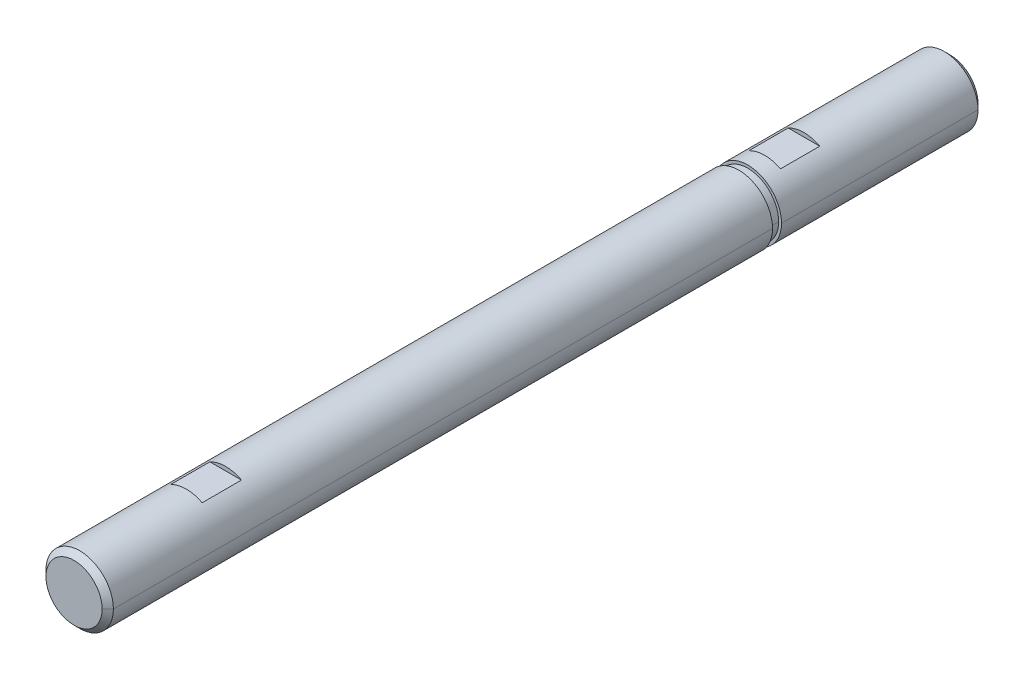
ISO-10303-21;
HEADER;
FILE_DESCRIPTION(('STEP AP214'),'2;1');
FILE_NAME('part.step','',(''),(''),'','','');
FILE_SCHEMA(('AUTOMOTIVE_DESIGN { 1 0 10303 214 1 1 1 1 }'));
ENDSEC;
DATA;
#1=APPLICATION_CONTEXT('core data for automotive mechanical design processes');
#2=APPLICATION_PROTOCOL_DEFINITION('international standard','automotive_design',2000,#1);
#3=PRODUCT_CONTEXT('',#1,'mechanical');
#4=PRODUCT('Part','Part','',(#3));
#5=PRODUCT_RELATED_PRODUCT_CATEGORY('part','',(#4));
#6=PRODUCT_DEFINITION_FORMATION('','',#4);
#7=PRODUCT_DEFINITION_CONTEXT('part definition',#1,'design');
#8=PRODUCT_DEFINITION('design','',#6,#7);
#9=PRODUCT_DEFINITION_SHAPE('','',#8);
#10=(LENGTH_UNIT() NAMED_UNIT(*) SI_UNIT(.MILLI.,.METRE.));
#11=(NAMED_UNIT(*) PLANE_ANGLE_UNIT() SI_UNIT($,.RADIAN.));
#12=(NAMED_UNIT(*) SI_UNIT($,.STERADIAN.) SOLID_ANGLE_UNIT());
#13=UNCERTAINTY_MEASURE_WITH_UNIT(LENGTH_MEASURE(1.E-05),#10,'distance_accuracy_value','');
#14=(GEOMETRIC_REPRESENTATION_CONTEXT(3) GLOBAL_UNCERTAINTY_ASSIGNED_CONTEXT((#13)) GLOBAL_UNIT_ASSIGNED_CONTEXT((#10,
#11,#12)) REPRESENTATION_CONTEXT('',''));
#15=CARTESIAN_POINT('',(0.,0.,0.));
#16=DIRECTION('',(0.,0.,1.));
#17=DIRECTION('',(1.,0.,0.));
#18=AXIS2_PLACEMENT_3D('',#15,#16,#17);
#19=CARTESIAN_POINT('',(0.,0.,78.));
#20=DIRECTION('',(0.,0.,-1.));
#21=DIRECTION('',(-1.,0.,0.));
#22=AXIS2_PLACEMENT_3D('',#19,#20,#21);
#23=CYLINDRICAL_SURFACE('',#22,3.);
#24=DIRECTION('',(0.,0.,-1.));
#25=VECTOR('',#24,1.);
#26=CARTESIAN_POINT('',(3.,0.,78.));
#27=LINE('',#26,#25);
#28=CARTESIAN_POINT('',(3.,0.,77.5));
#29=VERTEX_POINT('',#28);
#30=CARTESIAN_POINT('',(3.,0.,18.8));
#31=VERTEX_POINT('',#30);
#32=EDGE_CURVE('E199',#29,#31,#27,.T.);
#33=ORIENTED_EDGE('',*,*,#32,.F.);
#34=CARTESIAN_POINT('',(0.,0.,77.5));
#35=DIRECTION('',(0.,0.,-1.));
#36=DIRECTION('',(1.,0.,0.));
#37=AXIS2_PLACEMENT_3D('',#34,#35,#36);
#38=CIRCLE('',#37,3.);
#39=CARTESIAN_POINT('',(-3.,0.,77.5));
#40=VERTEX_POINT('',#39);
#41=EDGE_CURVE('E176',#29,#40,#38,.T.);
#42=ORIENTED_EDGE('',*,*,#41,.T.);
#43=DIRECTION('',(0.,0.,-1.));
#44=VECTOR('',#43,1.);
#45=CARTESIAN_POINT('',(-3.,0.,78.));
#46=LINE('',#45,#44);
#47=CARTESIAN_POINT('',(-3.,0.,18.8));
#48=VERTEX_POINT('',#47);
#49=EDGE_CURVE('E167',#40,#48,#46,.T.);
#50=ORIENTED_EDGE('',*,*,#49,.T.);
#51=CARTESIAN_POINT('',(0.,0.,18.8));
#52=DIRECTION('',(0.,0.,1.));
#53=DIRECTION('',(1.,0.,0.));
#54=AXIS2_PLACEMENT_3D('',#51,#52,#53);
#55=CIRCLE('',#54,3.);
#56=EDGE_CURVE('E165',#48,#31,#55,.T.);
#57=ORIENTED_EDGE('',*,*,#56,.T.);
#58=EDGE_LOOP('',(#33,#42,#50,#57));
#59=FACE_BOUND('',#58,.T.);
#60=ADVANCED_FACE('F17',(#59),#23,.T.);
#61=CARTESIAN_POINT('',(-2.,3.69848883343289,68.));
#62=DIRECTION('',(0.,0.,1.));
#63=DIRECTION('',(1.,0.,0.));
#64=AXIS2_PLACEMENT_3D('',#61,#62,#63);
#65=PLANE('',#64);
#66=DIRECTION('',(1.,0.,0.));
#67=VECTOR('',#66,1.);
#68=CARTESIAN_POINT('',(-2.,2.65,68.));
#69=LINE('',#68,#67);
#70=CARTESIAN_POINT('',(-1.40623611104252,2.65,68.));
#71=VERTEX_POINT('',#70);
#72=CARTESIAN_POINT('',(1.40623611104252,2.65,68.));
#73=VERTEX_POINT('',#72);
#74=EDGE_CURVE('E11',#71,#73,#69,.T.);
#75=ORIENTED_EDGE('',*,*,#74,.F.);
#76=CARTESIAN_POINT('',(0.,0.,68.));
#77=DIRECTION('',(0.,0.,1.));
#78=DIRECTION('',(1.,0.,0.));
#79=AXIS2_PLACEMENT_3D('',#76,#77,#78);
#80=CIRCLE('',#79,3.);
#81=EDGE_CURVE('E171',#73,#71,#80,.T.);
#82=ORIENTED_EDGE('',*,*,#81,.F.);
#83=EDGE_LOOP('',(#75,#82));
#84=FACE_BOUND('',#83,.T.);
#85=ADVANCED_FACE('F325',(#84),#65,.F.);
#86=CARTESIAN_POINT('',(-2.,2.65,68.));
#87=DIRECTION('',(0.,-1.,0.));
#88=DIRECTION('',(0.,0.,-1.));
#89=AXIS2_PLACEMENT_3D('',#86,#87,#88);
#90=PLANE('',#89);
#91=ORIENTED_EDGE('',*,*,#74,.T.);
#92=DIRECTION('',(0.,0.,1.));
#93=VECTOR('',#92,1.);
#94=CARTESIAN_POINT('',(1.40623611104252,2.65,78.));
#95=LINE('',#94,#93);
#96=CARTESIAN_POINT('',(1.40623611104252,2.65,64.5));
#97=VERTEX_POINT('',#96);
#98=EDGE_CURVE('E193',#97,#73,#95,.T.);
#99=ORIENTED_EDGE('',*,*,#98,.F.);
#100=DIRECTION('',(1.,0.,0.));
#101=VECTOR('',#100,1.);
#102=CARTESIAN_POINT('',(-2.,2.65,64.5));
#103=LINE('',#102,#101);
#104=CARTESIAN_POINT('',(-1.40623611104252,2.65,64.5));
#105=VERTEX_POINT('',#104);
#106=EDGE_CURVE('E28',#105,#97,#103,.T.);
#107=ORIENTED_EDGE('',*,*,#106,.F.);
#108=DIRECTION('',(0.,0.,-1.));
#109=VECTOR('',#108,1.);
#110=CARTESIAN_POINT('',(-1.40623611104252,2.65,78.));
#111=LINE('',#110,#109);
#112=EDGE_CURVE('E213',#71,#105,#111,.T.);
#113=ORIENTED_EDGE('',*,*,#112,.F.);
#114=EDGE_LOOP('',(#91,#99,#107,#113));
#115=FACE_BOUND('',#114,.T.);
#116=ADVANCED_FACE('F323',(#115),#90,.F.);
#117=CARTESIAN_POINT('',(-2.,3.69848883343289,64.5));
#118=DIRECTION('',(0.,0.,-1.));
#119=DIRECTION('',(0.,-1.,0.));
#120=AXIS2_PLACEMENT_3D('',#117,#118,#119);
#121=PLANE('',#120);
#122=ORIENTED_EDGE('',*,*,#106,.T.);
#123=CARTESIAN_POINT('',(0.,0.,64.5));
#124=DIRECTION('',(0.,0.,-1.));
#125=DIRECTION('',(-1.,0.,0.));
#126=AXIS2_PLACEMENT_3D('',#123,#124,#125);
#127=CIRCLE('',#126,3.);
#128=EDGE_CURVE('E198',#105,#97,#127,.T.);
#129=ORIENTED_EDGE('',*,*,#128,.F.);
#130=EDGE_LOOP('',(#122,#129));
#131=FACE_BOUND('',#130,.T.);
#132=ADVANCED_FACE('F321',(#131),#121,.F.);
#133=CARTESIAN_POINT('',(0.,0.,78.));
#134=DIRECTION('',(0.,0.,-1.));
#135=DIRECTION('',(-1.,0.,0.));
#136=AXIS2_PLACEMENT_3D('',#133,#134,#135);
#137=CONICAL_SURFACE('',#136,2.5,0.785398163397439);
#138=DIRECTION('',(0.707106781186541,0.,-0.707106781186554));
#139=VECTOR('',#138,1.);
#140=CARTESIAN_POINT('',(2.5,0.,78.));
#141=LINE('',#140,#139);
#142=CARTESIAN_POINT('',(2.5,0.,78.));
#143=VERTEX_POINT('',#142);
#144=EDGE_CURVE('E234',#143,#29,#141,.T.);
#145=ORIENTED_EDGE('',*,*,#144,.F.);
#146=CARTESIAN_POINT('',(0.,0.,78.));
#147=DIRECTION('',(0.,0.,1.));
#148=DIRECTION('',(1.,0.,0.));
#149=AXIS2_PLACEMENT_3D('',#146,#147,#148);
#150=CIRCLE('',#149,2.5);
#151=CARTESIAN_POINT('',(-2.5,0.,78.));
#152=VERTEX_POINT('',#151);
#153=EDGE_CURVE('E173',#152,#143,#150,.T.);
#154=ORIENTED_EDGE('',*,*,#153,.F.);
#155=DIRECTION('',(-0.707106781186541,0.,-0.707106781186554));
#156=VECTOR('',#155,1.);
#157=CARTESIAN_POINT('',(-2.5,0.,78.));
#158=LINE('',#157,#156);
#159=EDGE_CURVE('E238',#152,#40,#158,.T.);
#160=ORIENTED_EDGE('',*,*,#159,.T.);
#161=ORIENTED_EDGE('',*,*,#41,.F.);
#162=EDGE_LOOP('',(#145,#154,#160,#161));
#163=FACE_BOUND('',#162,.T.);
#164=ADVANCED_FACE('F364',(#163),#137,.T.);
#165=CARTESIAN_POINT('',(0.,0.,78.));
#166=DIRECTION('',(0.,0.,1.));
#167=DIRECTION('',(1.,0.,0.));
#168=AXIS2_PLACEMENT_3D('',#165,#166,#167);
#169=PLANE('',#168);
#170=ORIENTED_EDGE('',*,*,#153,.T.);
#171=CARTESIAN_POINT('',(0.,0.,78.));
#172=DIRECTION('',(0.,0.,1.));
#173=DIRECTION('',(1.,0.,0.));
#174=AXIS2_PLACEMENT_3D('',#171,#172,#173);
#175=CIRCLE('',#174,2.5);
#176=EDGE_CURVE('E197',#143,#152,#175,.T.);
#177=ORIENTED_EDGE('',*,*,#176,.T.);
#178=EDGE_LOOP('',(#170,#177));
#179=FACE_BOUND('',#178,.T.);
#180=ADVANCED_FACE('F338',(#179),#169,.T.);
#181=CARTESIAN_POINT('',(0.,0.,-3.9));
#182=DIRECTION('',(0.,0.,-1.));
#183=DIRECTION('',(-1.,0.,0.));
#184=AXIS2_PLACEMENT_3D('',#181,#182,#183);
#185=CYLINDRICAL_SURFACE('',#184,2.75);
#186=DIRECTION('',(0.,0.,-1.));
#187=VECTOR('',#186,1.);
#188=CARTESIAN_POINT('',(2.75,0.,-3.9));
#189=LINE('',#188,#187);
#190=CARTESIAN_POINT('',(2.75,0.,18.8));
#191=VERTEX_POINT('',#190);
#192=CARTESIAN_POINT('',(2.75,0.,18.));
#193=VERTEX_POINT('',#192);
#194=EDGE_CURVE('E188',#191,#193,#189,.T.);
#195=ORIENTED_EDGE('',*,*,#194,.F.);
#196=CARTESIAN_POINT('',(0.,0.,18.8));
#197=DIRECTION('',(0.,0.,-1.));
#198=DIRECTION('',(-1.,0.,0.));
#199=AXIS2_PLACEMENT_3D('',#196,#197,#198);
#200=CIRCLE('',#199,2.75);
#201=CARTESIAN_POINT('',(-2.75,0.,18.8));
#202=VERTEX_POINT('',#201);
#203=EDGE_CURVE('E177',#191,#202,#200,.T.);
#204=ORIENTED_EDGE('',*,*,#203,.T.);
#205=DIRECTION('',(0.,0.,-1.));
#206=VECTOR('',#205,1.);
#207=CARTESIAN_POINT('',(-2.75,0.,-3.9));
#208=LINE('',#207,#206);
#209=CARTESIAN_POINT('',(-2.75,0.,18.));
#210=VERTEX_POINT('',#209);
#211=EDGE_CURVE('E187',#202,#210,#208,.T.);
#212=ORIENTED_EDGE('',*,*,#211,.T.);
#213=CARTESIAN_POINT('',(0.,0.,18.));
#214=DIRECTION('',(0.,0.,-1.));
#215=DIRECTION('',(-1.,0.,0.));
#216=AXIS2_PLACEMENT_3D('',#213,#214,#215);
#217=CIRCLE('',#216,2.75);
#218=EDGE_CURVE('E229',#193,#210,#217,.T.);
#219=ORIENTED_EDGE('',*,*,#218,.F.);
#220=EDGE_LOOP('',(#195,#204,#212,#219));
#221=FACE_BOUND('',#220,.T.);
#222=ADVANCED_FACE('F274',(#221),#185,.T.);
#223=CARTESIAN_POINT('',(0.,4.01827559913924,18.8));
#224=DIRECTION('',(0.,0.,1.));
#225=DIRECTION('',(1.,0.,0.));
#226=AXIS2_PLACEMENT_3D('',#223,#224,#225);
#227=PLANE('',#226);
#228=CARTESIAN_POINT('',(0.,0.,18.8));
#229=DIRECTION('',(0.,0.,-1.));
#230=DIRECTION('',(-1.,0.,0.));
#231=AXIS2_PLACEMENT_3D('',#228,#229,#230);
#232=CIRCLE('',#231,2.75);
#233=EDGE_CURVE('E233',#202,#191,#232,.T.);
#234=ORIENTED_EDGE('',*,*,#233,.F.);
#235=ORIENTED_EDGE('',*,*,#203,.F.);
#236=EDGE_LOOP('',(#234,#235));
#237=FACE_BOUND('',#236,.T.);
#238=ORIENTED_EDGE('',*,*,#56,.F.);
#239=CARTESIAN_POINT('',(0.,0.,18.8));
#240=DIRECTION('',(0.,0.,1.));
#241=DIRECTION('',(1.,0.,0.));
#242=AXIS2_PLACEMENT_3D('',#239,#240,#241);
#243=CIRCLE('',#242,3.);
#244=EDGE_CURVE('E172',#31,#48,#243,.T.);
#245=ORIENTED_EDGE('',*,*,#244,.F.);
#246=EDGE_LOOP('',(#238,#245));
#247=FACE_BOUND('',#246,.T.);
#248=ADVANCED_FACE('F271',(#237,#247),#227,.F.);
#249=CARTESIAN_POINT('',(0.,4.01827559913924,18.));
#250=DIRECTION('',(0.,0.,-1.));
#251=DIRECTION('',(0.,-1.,0.));
#252=AXIS2_PLACEMENT_3D('',#249,#250,#251);
#253=PLANE('',#252);
#254=CARTESIAN_POINT('',(0.,0.,18.));
#255=DIRECTION('',(0.,0.,-1.));
#256=DIRECTION('',(-1.,0.,0.));
#257=AXIS2_PLACEMENT_3D('',#254,#255,#256);
#258=CIRCLE('',#257,2.75);
#259=EDGE_CURVE('E183',#210,#193,#258,.T.);
#260=ORIENTED_EDGE('',*,*,#259,.T.);
#261=ORIENTED_EDGE('',*,*,#218,.T.);
#262=EDGE_LOOP('',(#260,#261));
#263=FACE_BOUND('',#262,.T.);
#264=CARTESIAN_POINT('',(0.,0.,18.));
#265=DIRECTION('',(0.,0.,-1.));
#266=DIRECTION('',(-1.,0.,0.));
#267=AXIS2_PLACEMENT_3D('',#264,#265,#266);
#268=CIRCLE('',#267,3.);
#269=CARTESIAN_POINT('',(-3.,0.,18.));
#270=VERTEX_POINT('',#269);
#271=CARTESIAN_POINT('',(3.,0.,18.));
#272=VERTEX_POINT('',#271);
#273=EDGE_CURVE('E222',#270,#272,#268,.T.);
#274=ORIENTED_EDGE('',*,*,#273,.F.);
#275=CARTESIAN_POINT('',(0.,0.,18.));
#276=DIRECTION('',(0.,0.,-1.));
#277=DIRECTION('',(-1.,0.,0.));
#278=AXIS2_PLACEMENT_3D('',#275,#276,#277);
#279=CIRCLE('',#278,3.);
#280=EDGE_CURVE('E148',#272,#270,#279,.T.);
#281=ORIENTED_EDGE('',*,*,#280,.F.);
#282=EDGE_LOOP('',(#274,#281));
#283=FACE_BOUND('',#282,.T.);
#284=ADVANCED_FACE('F276',(#263,#283),#253,.F.);
#285=CARTESIAN_POINT('',(-2.,2.65,16.5));
#286=DIRECTION('',(0.,-1.,0.));
#287=DIRECTION('',(0.,0.,-1.));
#288=AXIS2_PLACEMENT_3D('',#285,#286,#287);
#289=PLANE('',#288);
#290=DIRECTION('',(1.,0.,0.));
#291=VECTOR('',#290,1.);
#292=CARTESIAN_POINT('',(-2.,2.65,16.5));
#293=LINE('',#292,#291);
#294=CARTESIAN_POINT('',(-1.40623611104252,2.65,16.5));
#295=VERTEX_POINT('',#294);
#296=CARTESIAN_POINT('',(1.40623611104252,2.65,16.5));
#297=VERTEX_POINT('',#296);
#298=EDGE_CURVE('E21',#295,#297,#293,.T.);
#299=ORIENTED_EDGE('',*,*,#298,.T.);
#300=DIRECTION('',(0.,0.,1.));
#301=VECTOR('',#300,1.);
#302=CARTESIAN_POINT('',(1.40623611104252,2.65,78.));
#303=LINE('',#302,#301);
#304=CARTESIAN_POINT('',(1.40623611104252,2.65,13.));
#305=VERTEX_POINT('',#304);
#306=EDGE_CURVE('E133',#305,#297,#303,.T.);
#307=ORIENTED_EDGE('',*,*,#306,.F.);
#308=DIRECTION('',(1.,0.,0.));
#309=VECTOR('',#308,1.);
#310=CARTESIAN_POINT('',(-2.,2.65,13.));
#311=LINE('',#310,#309);
#312=CARTESIAN_POINT('',(-1.40623611104252,2.65,13.));
#313=VERTEX_POINT('',#312);
#314=EDGE_CURVE('E42',#313,#305,#311,.T.);
#315=ORIENTED_EDGE('',*,*,#314,.F.);
#316=DIRECTION('',(0.,0.,-1.));
#317=VECTOR('',#316,1.);
#318=CARTESIAN_POINT('',(-1.40623611104252,2.65,78.));
#319=LINE('',#318,#317);
#320=EDGE_CURVE('E136',#295,#313,#319,.T.);
#321=ORIENTED_EDGE('',*,*,#320,.F.);
#322=EDGE_LOOP('',(#299,#307,#315,#321));
#323=FACE_BOUND('',#322,.T.);
#324=ADVANCED_FACE('F132',(#323),#289,.F.);
#325=CARTESIAN_POINT('',(-2.,3.69848883343288,13.));
#326=DIRECTION('',(0.,0.,-1.));
#327=DIRECTION('',(0.,-1.,0.));
#328=AXIS2_PLACEMENT_3D('',#325,#326,#327);
#329=PLANE('',#328);
#330=ORIENTED_EDGE('',*,*,#314,.T.);
#331=CARTESIAN_POINT('',(0.,0.,13.));
#332=DIRECTION('',(0.,0.,-1.));
#333=DIRECTION('',(-1.,0.,0.));
#334=AXIS2_PLACEMENT_3D('',#331,#332,#333);
#335=CIRCLE('',#334,3.);
#336=EDGE_CURVE('E146',#313,#305,#335,.T.);
#337=ORIENTED_EDGE('',*,*,#336,.F.);
#338=EDGE_LOOP('',(#330,#337));
#339=FACE_BOUND('',#338,.T.);
#340=ADVANCED_FACE('F19',(#339),#329,.F.);
#341=CARTESIAN_POINT('',(-2.,3.69848883343288,16.5));
#342=DIRECTION('',(0.,0.,1.));
#343=DIRECTION('',(1.,0.,0.));
#344=AXIS2_PLACEMENT_3D('',#341,#342,#343);
#345=PLANE('',#344);
#346=ORIENTED_EDGE('',*,*,#298,.F.);
#347=CARTESIAN_POINT('',(0.,0.,16.5));
#348=DIRECTION('',(0.,0.,1.));
#349=DIRECTION('',(1.,0.,0.));
#350=AXIS2_PLACEMENT_3D('',#347,#348,#349);
#351=CIRCLE('',#350,3.);
#352=EDGE_CURVE('E145',#297,#295,#351,.T.);
#353=ORIENTED_EDGE('',*,*,#352,.F.);
#354=EDGE_LOOP('',(#346,#353));
#355=FACE_BOUND('',#354,.T.);
#356=ADVANCED_FACE('F150',(#355),#345,.F.);
#357=CARTESIAN_POINT('',(0.,0.,0.500000000000028));
#358=DIRECTION('',(0.,0.,1.));
#359=DIRECTION('',(1.,0.,0.));
#360=AXIS2_PLACEMENT_3D('',#357,#358,#359);
#361=CONICAL_SURFACE('',#360,3.,0.785398163397446);
#362=DIRECTION('',(-0.707106781186546,0.,0.707106781186549));
#363=VECTOR('',#362,1.);
#364=CARTESIAN_POINT('',(-3.,0.,0.500000000000028));
#365=LINE('',#364,#363);
#366=CARTESIAN_POINT('',(-2.49999999999997,0.,0.));
#367=VERTEX_POINT('',#366);
#368=CARTESIAN_POINT('',(-3.,0.,0.500000000000028));
#369=VERTEX_POINT('',#368);
#370=EDGE_CURVE('E214',#367,#369,#365,.T.);
#371=ORIENTED_EDGE('',*,*,#370,.F.);
#372=CARTESIAN_POINT('',(0.,0.,0.));
#373=DIRECTION('',(0.,0.,-1.));
#374=DIRECTION('',(1.,0.,0.));
#375=AXIS2_PLACEMENT_3D('',#372,#373,#374);
#376=CIRCLE('',#375,2.49999999999997);
#377=CARTESIAN_POINT('',(2.49999999999997,0.,0.));
#378=VERTEX_POINT('',#377);
#379=EDGE_CURVE('E141',#378,#367,#376,.T.);
#380=ORIENTED_EDGE('',*,*,#379,.F.);
#381=DIRECTION('',(0.707106781186546,0.,0.707106781186549));
#382=VECTOR('',#381,1.);
#383=CARTESIAN_POINT('',(3.,0.,0.500000000000028));
#384=LINE('',#383,#382);
#385=CARTESIAN_POINT('',(3.,0.,0.500000000000028));
#386=VERTEX_POINT('',#385);
#387=EDGE_CURVE('E226',#378,#386,#384,.T.);
#388=ORIENTED_EDGE('',*,*,#387,.T.);
#389=CARTESIAN_POINT('',(0.,0.,0.500000000000028));
#390=DIRECTION('',(0.,0.,1.));
#391=DIRECTION('',(1.,0.,0.));
#392=AXIS2_PLACEMENT_3D('',#389,#390,#391);
#393=CIRCLE('',#392,3.);
#394=EDGE_CURVE('E180',#369,#386,#393,.T.);
#395=ORIENTED_EDGE('',*,*,#394,.F.);
#396=EDGE_LOOP('',(#371,#380,#388,#395));
#397=FACE_BOUND('',#396,.T.);
#398=ADVANCED_FACE('F293',(#397),#361,.T.);
#399=CARTESIAN_POINT('',(0.,0.,0.));
#400=DIRECTION('',(0.,0.,1.));
#401=DIRECTION('',(1.,0.,0.));
#402=AXIS2_PLACEMENT_3D('',#399,#400,#401);
#403=PLANE('',#402);
#404=ORIENTED_EDGE('',*,*,#379,.T.);
#405=CARTESIAN_POINT('',(0.,0.,0.));
#406=DIRECTION('',(0.,0.,-1.));
#407=DIRECTION('',(1.,0.,0.));
#408=AXIS2_PLACEMENT_3D('',#405,#406,#407);
#409=CIRCLE('',#408,2.49999999999997);
#410=EDGE_CURVE('E209',#367,#378,#409,.T.);
#411=ORIENTED_EDGE('',*,*,#410,.T.);
#412=EDGE_LOOP('',(#404,#411));
#413=FACE_BOUND('',#412,.T.);
#414=ADVANCED_FACE('F342',(#413),#403,.F.);
#415=CARTESIAN_POINT('',(0.,0.,78.));
#416=DIRECTION('',(0.,0.,-1.));
#417=DIRECTION('',(-1.,0.,0.));
#418=AXIS2_PLACEMENT_3D('',#415,#416,#417);
#419=CYLINDRICAL_SURFACE('',#418,3.);
#420=DIRECTION('',(0.,0.,-1.));
#421=VECTOR('',#420,1.);
#422=CARTESIAN_POINT('',(3.,0.,78.));
#423=LINE('',#422,#421);
#424=EDGE_CURVE('E161',#272,#386,#423,.T.);
#425=ORIENTED_EDGE('',*,*,#424,.F.);
#426=ORIENTED_EDGE('',*,*,#280,.T.);
#427=DIRECTION('',(0.,0.,-1.));
#428=VECTOR('',#427,1.);
#429=CARTESIAN_POINT('',(-3.,0.,78.));
#430=LINE('',#429,#428);
#431=EDGE_CURVE('E152',#270,#369,#430,.T.);
#432=ORIENTED_EDGE('',*,*,#431,.T.);
#433=ORIENTED_EDGE('',*,*,#394,.T.);
#434=EDGE_LOOP('',(#425,#426,#432,#433));
#435=FACE_BOUND('',#434,.T.);
#436=ADVANCED_FACE('F285',(#435),#419,.T.);
#437=CARTESIAN_POINT('',(0.,0.,78.));
#438=DIRECTION('',(0.,0.,-1.));
#439=DIRECTION('',(-1.,0.,0.));
#440=AXIS2_PLACEMENT_3D('',#437,#438,#439);
#441=CYLINDRICAL_SURFACE('',#440,3.);
#442=ORIENTED_EDGE('',*,*,#352,.T.);
#443=ORIENTED_EDGE('',*,*,#320,.T.);
#444=ORIENTED_EDGE('',*,*,#336,.T.);
#445=ORIENTED_EDGE('',*,*,#306,.T.);
#446=EDGE_LOOP('',(#442,#443,#444,#445));
#447=FACE_BOUND('',#446,.T.);
#448=ORIENTED_EDGE('',*,*,#273,.T.);
#449=ORIENTED_EDGE('',*,*,#424,.T.);
#450=CARTESIAN_POINT('',(0.,0.,0.500000000000028));
#451=DIRECTION('',(0.,0.,1.));
#452=DIRECTION('',(1.,0.,0.));
#453=AXIS2_PLACEMENT_3D('',#450,#451,#452);
#454=CIRCLE('',#453,3.);
#455=EDGE_CURVE('E218',#386,#369,#454,.T.);
#456=ORIENTED_EDGE('',*,*,#455,.T.);
#457=ORIENTED_EDGE('',*,*,#431,.F.);
#458=EDGE_LOOP('',(#448,#449,#456,#457));
#459=FACE_BOUND('',#458,.T.);
#460=ADVANCED_FACE('F143',(#447,#459),#441,.T.);
#461=CARTESIAN_POINT('',(0.,0.,0.500000000000028));
#462=DIRECTION('',(0.,0.,1.));
#463=DIRECTION('',(1.,0.,0.));
#464=AXIS2_PLACEMENT_3D('',#461,#462,#463);
#465=CONICAL_SURFACE('',#464,3.,0.785398163397446);
#466=ORIENTED_EDGE('',*,*,#410,.F.);
#467=ORIENTED_EDGE('',*,*,#370,.T.);
#468=ORIENTED_EDGE('',*,*,#455,.F.);
#469=ORIENTED_EDGE('',*,*,#387,.F.);
#470=EDGE_LOOP('',(#466,#467,#468,#469));
#471=FACE_BOUND('',#470,.T.);
#472=ADVANCED_FACE('F298',(#471),#465,.T.);
#473=CARTESIAN_POINT('',(0.,0.,-3.9));
#474=DIRECTION('',(0.,0.,-1.));
#475=DIRECTION('',(-1.,0.,0.));
#476=AXIS2_PLACEMENT_3D('',#473,#474,#475);
#477=CYLINDRICAL_SURFACE('',#476,2.75);
#478=ORIENTED_EDGE('',*,*,#233,.T.);
#479=ORIENTED_EDGE('',*,*,#194,.T.);
#480=ORIENTED_EDGE('',*,*,#259,.F.);
#481=ORIENTED_EDGE('',*,*,#211,.F.);
#482=EDGE_LOOP('',(#478,#479,#480,#481));
#483=FACE_BOUND('',#482,.T.);
#484=ADVANCED_FACE('F267',(#483),#477,.T.);
#485=CARTESIAN_POINT('',(0.,0.,78.));
#486=DIRECTION('',(0.,0.,-1.));
#487=DIRECTION('',(-1.,0.,0.));
#488=AXIS2_PLACEMENT_3D('',#485,#486,#487);
#489=CONICAL_SURFACE('',#488,2.5,0.785398163397439);
#490=ORIENTED_EDGE('',*,*,#176,.F.);
#491=ORIENTED_EDGE('',*,*,#144,.T.);
#492=CARTESIAN_POINT('',(0.,0.,77.5));
#493=DIRECTION('',(0.,0.,-1.));
#494=DIRECTION('',(1.,0.,0.));
#495=AXIS2_PLACEMENT_3D('',#492,#493,#494);
#496=CIRCLE('',#495,3.);
#497=EDGE_CURVE('E203',#40,#29,#496,.T.);
#498=ORIENTED_EDGE('',*,*,#497,.F.);
#499=ORIENTED_EDGE('',*,*,#159,.F.);
#500=EDGE_LOOP('',(#490,#491,#498,#499));
#501=FACE_BOUND('',#500,.T.);
#502=ADVANCED_FACE('F346',(#501),#489,.T.);
#503=CARTESIAN_POINT('',(0.,0.,78.));
#504=DIRECTION('',(0.,0.,-1.));
#505=DIRECTION('',(-1.,0.,0.));
#506=AXIS2_PLACEMENT_3D('',#503,#504,#505);
#507=CYLINDRICAL_SURFACE('',#506,3.);
#508=ORIENTED_EDGE('',*,*,#81,.T.);
#509=ORIENTED_EDGE('',*,*,#112,.T.);
#510=ORIENTED_EDGE('',*,*,#128,.T.);
#511=ORIENTED_EDGE('',*,*,#98,.T.);
#512=EDGE_LOOP('',(#508,#509,#510,#511));
#513=FACE_BOUND('',#512,.T.);
#514=ORIENTED_EDGE('',*,*,#497,.T.);
#515=ORIENTED_EDGE('',*,*,#32,.T.);
#516=ORIENTED_EDGE('',*,*,#244,.T.);
#517=ORIENTED_EDGE('',*,*,#49,.F.);
#518=EDGE_LOOP('',(#514,#515,#516,#517));
#519=FACE_BOUND('',#518,.T.);
#520=ADVANCED_FACE('F315',(#513,#519),#507,.T.);
#521=CLOSED_SHELL('',(#60,#85,#116,#132,#164,#180,#222,#248,#284,#324,#340,#356,#398,#414,#436,
#460,#472,#484,#502,#520));
#522=MANIFOLD_SOLID_BREP('B1',#521);
#523=ADVANCED_BREP_SHAPE_REPRESENTATION('',(#18,#522),#14);
#524=SHAPE_DEFINITION_REPRESENTATION(#9,#523);
ENDSEC;
END-ISO-10303-21;
